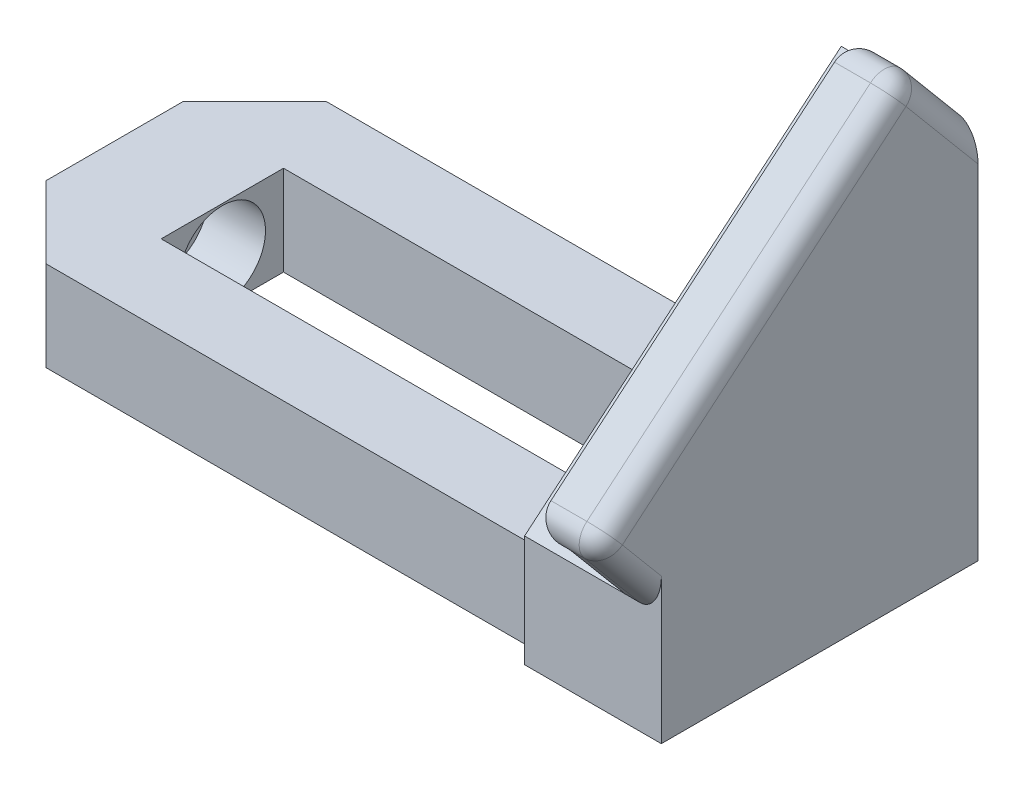
ISO-10303-21;
HEADER;
FILE_DESCRIPTION(('STEP AP214'),'2;1');
FILE_NAME('part.step','',(''),(''),'','','');
FILE_SCHEMA(('AUTOMOTIVE_DESIGN { 1 0 10303 214 1 1 1 1 }'));
ENDSEC;
DATA;
#1=APPLICATION_CONTEXT('core data for automotive mechanical design processes');
#2=APPLICATION_PROTOCOL_DEFINITION('international standard','automotive_design',2000,#1);
#3=PRODUCT_CONTEXT('',#1,'mechanical');
#4=PRODUCT('Part','Part','',(#3));
#5=PRODUCT_RELATED_PRODUCT_CATEGORY('part','',(#4));
#6=PRODUCT_DEFINITION_FORMATION('','',#4);
#7=PRODUCT_DEFINITION_CONTEXT('part definition',#1,'design');
#8=PRODUCT_DEFINITION('design','',#6,#7);
#9=PRODUCT_DEFINITION_SHAPE('','',#8);
#10=(LENGTH_UNIT() NAMED_UNIT(*) SI_UNIT(.MILLI.,.METRE.));
#11=(NAMED_UNIT(*) PLANE_ANGLE_UNIT() SI_UNIT($,.RADIAN.));
#12=(NAMED_UNIT(*) SI_UNIT($,.STERADIAN.) SOLID_ANGLE_UNIT());
#13=UNCERTAINTY_MEASURE_WITH_UNIT(LENGTH_MEASURE(1.E-05),#10,'distance_accuracy_value','');
#14=(GEOMETRIC_REPRESENTATION_CONTEXT(3) GLOBAL_UNCERTAINTY_ASSIGNED_CONTEXT((#13)) GLOBAL_UNIT_ASSIGNED_CONTEXT((#10,
#11,#12)) REPRESENTATION_CONTEXT('',''));
#15=CARTESIAN_POINT('',(0.,0.,0.));
#16=DIRECTION('',(0.,0.,1.));
#17=DIRECTION('',(1.,0.,0.));
#18=AXIS2_PLACEMENT_3D('',#15,#16,#17);
#19=CARTESIAN_POINT('',(-19.,52.4203837717999,-41.5));
#20=DIRECTION('',(0.,0.766044443118982,0.642787609686535));
#21=DIRECTION('',(0.,-0.642787609686535,0.766044443118982));
#22=AXIS2_PLACEMENT_3D('',#19,#20,#21);
#23=PLANE('',#22);
#24=DIRECTION('',(1.,0.,0.));
#25=VECTOR('',#24,1.);
#26=CARTESIAN_POINT('',(0.,15.5,2.50000000000001));
#27=LINE('',#26,#25);
#28=CARTESIAN_POINT('',(-19.,15.5,2.50000000000001));
#29=VERTEX_POINT('',#28);
#30=CARTESIAN_POINT('',(-5.5,15.5,2.50000000000001));
#31=VERTEX_POINT('',#30);
#32=EDGE_CURVE('E281',#29,#31,#27,.T.);
#33=ORIENTED_EDGE('',*,*,#32,.T.);
#34=DIRECTION('',(0.,0.642787609686535,-0.766044443118982));
#35=VECTOR('',#34,1.);
#36=CARTESIAN_POINT('',(-5.5,52.4203837717999,-41.5));
#37=LINE('',#36,#35);
#38=CARTESIAN_POINT('',(-5.5,52.4203837717999,-41.5));
#39=VERTEX_POINT('',#38);
#40=EDGE_CURVE('E390',#31,#39,#37,.T.);
#41=ORIENTED_EDGE('',*,*,#40,.T.);
#42=DIRECTION('',(1.,0.,0.));
#43=VECTOR('',#42,1.);
#44=CARTESIAN_POINT('',(-19.,52.4203837717999,-41.5));
#45=LINE('',#44,#43);
#46=CARTESIAN_POINT('',(-19.,52.4203837717999,-41.5));
#47=VERTEX_POINT('',#46);
#48=EDGE_CURVE('E279',#47,#39,#45,.T.);
#49=ORIENTED_EDGE('',*,*,#48,.F.);
#50=DIRECTION('',(0.,-0.642787609686535,0.766044443118982));
#51=VECTOR('',#50,1.);
#52=CARTESIAN_POINT('',(-19.,52.4203837717999,-41.5));
#53=LINE('',#52,#51);
#54=EDGE_CURVE('E276',#47,#29,#53,.T.);
#55=ORIENTED_EDGE('',*,*,#54,.T.);
#56=EDGE_LOOP('',(#33,#41,#49,#55));
#57=FACE_BOUND('',#56,.T.);
#58=ADVANCED_FACE('F34',(#57),#23,.T.);
#59=CARTESIAN_POINT('',(-98.,12.5,0.));
#60=DIRECTION('',(-1.,0.,0.));
#61=DIRECTION('',(0.,0.,1.));
#62=AXIS2_PLACEMENT_3D('',#59,#60,#61);
#63=PLANE('',#62);
#64=DIRECTION('',(0.,0.,-1.));
#65=VECTOR('',#64,1.);
#66=CARTESIAN_POINT('',(-98.,0.,0.));
#67=LINE('',#66,#65);
#68=CARTESIAN_POINT('',(-98.,0.,-9.99999999999998));
#69=VERTEX_POINT('',#68);
#70=CARTESIAN_POINT('',(-98.,0.,-29.));
#71=VERTEX_POINT('',#70);
#72=EDGE_CURVE('E352',#69,#71,#67,.T.);
#73=ORIENTED_EDGE('',*,*,#72,.F.);
#74=DIRECTION('',(0.,-1.,0.));
#75=VECTOR('',#74,1.);
#76=CARTESIAN_POINT('',(-98.,12.5,-9.99999999999998));
#77=LINE('',#76,#75);
#78=CARTESIAN_POINT('',(-98.,12.5,-9.99999999999998));
#79=VERTEX_POINT('',#78);
#80=EDGE_CURVE('E375',#79,#69,#77,.T.);
#81=ORIENTED_EDGE('',*,*,#80,.F.);
#82=DIRECTION('',(0.,0.,-1.));
#83=VECTOR('',#82,1.);
#84=CARTESIAN_POINT('',(-98.,12.5,0.));
#85=LINE('',#84,#83);
#86=CARTESIAN_POINT('',(-98.,12.5,-29.));
#87=VERTEX_POINT('',#86);
#88=EDGE_CURVE('E328',#79,#87,#85,.T.);
#89=ORIENTED_EDGE('',*,*,#88,.T.);
#90=DIRECTION('',(0.,-1.,0.));
#91=VECTOR('',#90,1.);
#92=CARTESIAN_POINT('',(-98.,12.5,-29.));
#93=LINE('',#92,#91);
#94=EDGE_CURVE('E366',#87,#71,#93,.T.);
#95=ORIENTED_EDGE('',*,*,#94,.T.);
#96=EDGE_LOOP('',(#73,#81,#89,#95));
#97=FACE_BOUND('',#96,.T.);
#98=ADVANCED_FACE('F456',(#97),#63,.T.);
#99=CARTESIAN_POINT('',(-44.,12.5,44.));
#100=DIRECTION('',(0.707106781186548,0.,-0.707106781186547));
#101=DIRECTION('',(-0.707106781186547,0.,-0.707106781186548));
#102=AXIS2_PLACEMENT_3D('',#99,#100,#101);
#103=PLANE('',#102);
#104=DIRECTION('',(0.707106781186547,0.,0.707106781186548));
#105=VECTOR('',#104,1.);
#106=CARTESIAN_POINT('',(-44.,0.,44.));
#107=LINE('',#106,#105);
#108=CARTESIAN_POINT('',(-88.,0.,0.));
#109=VERTEX_POINT('',#108);
#110=EDGE_CURVE('E355',#69,#109,#107,.T.);
#111=ORIENTED_EDGE('',*,*,#110,.T.);
#112=DIRECTION('',(0.,-1.,0.));
#113=VECTOR('',#112,1.);
#114=CARTESIAN_POINT('',(-88.,12.5,0.));
#115=LINE('',#114,#113);
#116=CARTESIAN_POINT('',(-88.,12.5,0.));
#117=VERTEX_POINT('',#116);
#118=EDGE_CURVE('E372',#117,#109,#115,.T.);
#119=ORIENTED_EDGE('',*,*,#118,.F.);
#120=DIRECTION('',(0.707106781186547,0.,0.707106781186548));
#121=VECTOR('',#120,1.);
#122=CARTESIAN_POINT('',(-44.,12.5,44.));
#123=LINE('',#122,#121);
#124=EDGE_CURVE('E331',#79,#117,#123,.T.);
#125=ORIENTED_EDGE('',*,*,#124,.F.);
#126=ORIENTED_EDGE('',*,*,#80,.T.);
#127=EDGE_LOOP('',(#111,#119,#125,#126));
#128=FACE_BOUND('',#127,.T.);
#129=ADVANCED_FACE('F462',(#128),#103,.F.);
#130=CARTESIAN_POINT('',(0.,12.5,0.));
#131=DIRECTION('',(0.,0.,1.));
#132=DIRECTION('',(1.,0.,0.));
#133=AXIS2_PLACEMENT_3D('',#130,#131,#132);
#134=PLANE('',#133);
#135=DIRECTION('',(0.,-1.,0.));
#136=VECTOR('',#135,1.);
#137=CARTESIAN_POINT('',(-19.,12.5,0.));
#138=LINE('',#137,#136);
#139=CARTESIAN_POINT('',(-19.,12.5,0.));
#140=VERTEX_POINT('',#139);
#141=CARTESIAN_POINT('',(-19.,0.,0.));
#142=VERTEX_POINT('',#141);
#143=EDGE_CURVE('E309',#140,#142,#138,.T.);
#144=ORIENTED_EDGE('',*,*,#143,.F.);
#145=DIRECTION('',(-1.,0.,0.));
#146=VECTOR('',#145,1.);
#147=CARTESIAN_POINT('',(0.,12.5,0.));
#148=LINE('',#147,#146);
#149=EDGE_CURVE('E334',#140,#117,#148,.T.);
#150=ORIENTED_EDGE('',*,*,#149,.T.);
#151=ORIENTED_EDGE('',*,*,#118,.T.);
#152=DIRECTION('',(-1.,0.,0.));
#153=VECTOR('',#152,1.);
#154=CARTESIAN_POINT('',(0.,0.,0.));
#155=LINE('',#154,#153);
#156=EDGE_CURVE('E358',#142,#109,#155,.T.);
#157=ORIENTED_EDGE('',*,*,#156,.F.);
#158=EDGE_LOOP('',(#144,#150,#151,#157));
#159=FACE_BOUND('',#158,.T.);
#160=ADVANCED_FACE('F502',(#159),#134,.T.);
#161=CARTESIAN_POINT('',(0.,12.5,0.));
#162=DIRECTION('',(-1.,0.,0.));
#163=DIRECTION('',(0.,0.,1.));
#164=AXIS2_PLACEMENT_3D('',#161,#162,#163);
#165=PLANE('',#164);
#166=DIRECTION('',(0.,0.766044443118981,0.642787609686535));
#167=VECTOR('',#166,1.);
#168=CARTESIAN_POINT('',(0.,17.4283628290596,0.201866670643088));
#169=LINE('',#168,#167);
#170=CARTESIAN_POINT('',(0.,26.6208961464874,7.91531798688151));
#171=VERTEX_POINT('',#170);
#172=CARTESIAN_POINT('',(0.,20.1671714805812,2.50000000000001));
#173=VERTEX_POINT('',#172);
#174=EDGE_CURVE('E238',#171,#173,#169,.F.);
#175=ORIENTED_EDGE('',*,*,#174,.T.);
#176=DIRECTION('',(0.,1.,0.));
#177=VECTOR('',#176,1.);
#178=CARTESIAN_POINT('',(0.,0.,2.50000000000001));
#179=LINE('',#178,#177);
#180=CARTESIAN_POINT('',(0.,0.,2.50000000000001));
#181=VERTEX_POINT('',#180);
#182=EDGE_CURVE('E295',#181,#173,#179,.T.);
#183=ORIENTED_EDGE('',*,*,#182,.F.);
#184=DIRECTION('',(0.,0.,-1.));
#185=VECTOR('',#184,1.);
#186=CARTESIAN_POINT('',(0.,0.,0.));
#187=LINE('',#186,#185);
#188=CARTESIAN_POINT('',(0.,0.,-41.5));
#189=VERTEX_POINT('',#188);
#190=EDGE_CURVE('E360',#181,#189,#187,.T.);
#191=ORIENTED_EDGE('',*,*,#190,.T.);
#192=DIRECTION('',(0.,1.,0.));
#193=VECTOR('',#192,1.);
#194=CARTESIAN_POINT('',(0.,0.,-41.5));
#195=LINE('',#194,#193);
#196=CARTESIAN_POINT('',(0.,47.7532122912187,-41.5));
#197=VERTEX_POINT('',#196);
#198=EDGE_CURVE('E294',#189,#197,#195,.T.);
#199=ORIENTED_EDGE('',*,*,#198,.T.);
#200=DIRECTION('',(0.,0.766044443118981,0.642787609686535));
#201=VECTOR('',#200,1.);
#202=CARTESIAN_POINT('',(0.,47.5005389849747,-41.7120180780777));
#203=LINE('',#202,#201);
#204=CARTESIAN_POINT('',(0.,59.6845542601681,-31.4884153544046));
#205=VERTEX_POINT('',#204);
#206=EDGE_CURVE('E234',#197,#205,#203,.T.);
#207=ORIENTED_EDGE('',*,*,#206,.T.);
#208=DIRECTION('',(0.,0.642787609686535,-0.766044443118982));
#209=VECTOR('',#208,1.);
#210=CARTESIAN_POINT('',(0.,24.6840152751935,10.2236027236731));
#211=LINE('',#210,#209);
#212=EDGE_CURVE('E236',#205,#171,#211,.F.);
#213=ORIENTED_EDGE('',*,*,#212,.T.);
#214=EDGE_LOOP('',(#175,#183,#191,#199,#207,#213));
#215=FACE_BOUND('',#214,.T.);
#216=ADVANCED_FACE('F438',(#215),#165,.F.);
#217=CARTESIAN_POINT('',(0.,12.5,-39.));
#218=DIRECTION('',(0.,0.,1.));
#219=DIRECTION('',(1.,0.,0.));
#220=AXIS2_PLACEMENT_3D('',#217,#218,#219);
#221=PLANE('',#220);
#222=DIRECTION('',(-1.,0.,0.));
#223=VECTOR('',#222,1.);
#224=CARTESIAN_POINT('',(0.,12.5,-39.));
#225=LINE('',#224,#223);
#226=CARTESIAN_POINT('',(-19.,12.5,-39.));
#227=VERTEX_POINT('',#226);
#228=CARTESIAN_POINT('',(-88.,12.5,-39.));
#229=VERTEX_POINT('',#228);
#230=EDGE_CURVE('E336',#227,#229,#225,.T.);
#231=ORIENTED_EDGE('',*,*,#230,.F.);
#232=DIRECTION('',(0.,-1.,0.));
#233=VECTOR('',#232,1.);
#234=CARTESIAN_POINT('',(-19.,12.5,-39.));
#235=LINE('',#234,#233);
#236=CARTESIAN_POINT('',(-19.,0.,-39.));
#237=VERTEX_POINT('',#236);
#238=EDGE_CURVE('E307',#227,#237,#235,.T.);
#239=ORIENTED_EDGE('',*,*,#238,.T.);
#240=DIRECTION('',(-1.,0.,0.));
#241=VECTOR('',#240,1.);
#242=CARTESIAN_POINT('',(0.,0.,-39.));
#243=LINE('',#242,#241);
#244=CARTESIAN_POINT('',(-88.,0.,-39.));
#245=VERTEX_POINT('',#244);
#246=EDGE_CURVE('E362',#237,#245,#243,.T.);
#247=ORIENTED_EDGE('',*,*,#246,.T.);
#248=DIRECTION('',(0.,-1.,0.));
#249=VECTOR('',#248,1.);
#250=CARTESIAN_POINT('',(-88.,12.5,-39.));
#251=LINE('',#250,#249);
#252=EDGE_CURVE('E368',#229,#245,#251,.T.);
#253=ORIENTED_EDGE('',*,*,#252,.F.);
#254=EDGE_LOOP('',(#231,#239,#247,#253));
#255=FACE_BOUND('',#254,.T.);
#256=ADVANCED_FACE('F495',(#255),#221,.F.);
#257=CARTESIAN_POINT('',(0.,12.5,-11.));
#258=DIRECTION('',(0.,0.,1.));
#259=DIRECTION('',(1.,0.,0.));
#260=AXIS2_PLACEMENT_3D('',#257,#258,#259);
#261=PLANE('',#260);
#262=DIRECTION('',(-1.,0.,0.));
#263=VECTOR('',#262,1.);
#264=CARTESIAN_POINT('',(0.,0.,-11.));
#265=LINE('',#264,#263);
#266=CARTESIAN_POINT('',(-19.,0.,-11.));
#267=VERTEX_POINT('',#266);
#268=CARTESIAN_POINT('',(-83.,0.,-11.));
#269=VERTEX_POINT('',#268);
#270=EDGE_CURVE('E316',#267,#269,#265,.T.);
#271=ORIENTED_EDGE('',*,*,#270,.T.);
#272=DIRECTION('',(0.,-1.,0.));
#273=VECTOR('',#272,1.);
#274=CARTESIAN_POINT('',(-83.,12.5,-11.));
#275=LINE('',#274,#273);
#276=CARTESIAN_POINT('',(-83.,12.5,-11.));
#277=VERTEX_POINT('',#276);
#278=EDGE_CURVE('E369',#277,#269,#275,.T.);
#279=ORIENTED_EDGE('',*,*,#278,.F.);
#280=DIRECTION('',(-1.,0.,0.));
#281=VECTOR('',#280,1.);
#282=CARTESIAN_POINT('',(0.,12.5,-11.));
#283=LINE('',#282,#281);
#284=CARTESIAN_POINT('',(-19.,12.5,-11.));
#285=VERTEX_POINT('',#284);
#286=EDGE_CURVE('E319',#285,#277,#283,.T.);
#287=ORIENTED_EDGE('',*,*,#286,.F.);
#288=DIRECTION('',(0.,-1.,0.));
#289=VECTOR('',#288,1.);
#290=CARTESIAN_POINT('',(-19.,12.5,-11.));
#291=LINE('',#290,#289);
#292=EDGE_CURVE('E340',#285,#267,#291,.T.);
#293=ORIENTED_EDGE('',*,*,#292,.T.);
#294=EDGE_LOOP('',(#271,#279,#287,#293));
#295=FACE_BOUND('',#294,.T.);
#296=ADVANCED_FACE('F498',(#295),#261,.F.);
#297=CARTESIAN_POINT('',(-83.,12.5,0.));
#298=DIRECTION('',(-1.,0.,0.));
#299=DIRECTION('',(0.,0.,1.));
#300=AXIS2_PLACEMENT_3D('',#297,#298,#299);
#301=PLANE('',#300);
#302=CARTESIAN_POINT('',(-83.,6.25,-19.5000000000001));
#303=DIRECTION('',(1.,0.,0.));
#304=DIRECTION('',(0.,0.,-1.));
#305=AXIS2_PLACEMENT_3D('',#302,#303,#304);
#306=CIRCLE('',#305,6.);
#307=CARTESIAN_POINT('',(-83.,6.25,-25.5000000000001));
#308=VERTEX_POINT('',#307);
#309=EDGE_CURVE('E312',#308,#308,#306,.T.);
#310=ORIENTED_EDGE('',*,*,#309,.F.);
#311=EDGE_LOOP('',(#310));
#312=FACE_BOUND('',#311,.T.);
#313=DIRECTION('',(0.,0.,-1.));
#314=VECTOR('',#313,1.);
#315=CARTESIAN_POINT('',(-83.,0.,0.));
#316=LINE('',#315,#314);
#317=CARTESIAN_POINT('',(-83.,0.,-28.));
#318=VERTEX_POINT('',#317);
#319=EDGE_CURVE('E343',#269,#318,#316,.T.);
#320=ORIENTED_EDGE('',*,*,#319,.T.);
#321=DIRECTION('',(0.,-1.,0.));
#322=VECTOR('',#321,1.);
#323=CARTESIAN_POINT('',(-83.,12.5,-28.));
#324=LINE('',#323,#322);
#325=CARTESIAN_POINT('',(-83.,12.5,-28.));
#326=VERTEX_POINT('',#325);
#327=EDGE_CURVE('E381',#326,#318,#324,.T.);
#328=ORIENTED_EDGE('',*,*,#327,.F.);
#329=DIRECTION('',(0.,0.,-1.));
#330=VECTOR('',#329,1.);
#331=CARTESIAN_POINT('',(-83.,12.5,0.));
#332=LINE('',#331,#330);
#333=EDGE_CURVE('E322',#277,#326,#332,.T.);
#334=ORIENTED_EDGE('',*,*,#333,.F.);
#335=ORIENTED_EDGE('',*,*,#278,.T.);
#336=EDGE_LOOP('',(#320,#328,#334,#335));
#337=FACE_BOUND('',#336,.T.);
#338=ADVANCED_FACE('F515',(#312,#337),#301,.F.);
#339=CARTESIAN_POINT('',(0.,12.5,-28.));
#340=DIRECTION('',(0.,0.,1.));
#341=DIRECTION('',(1.,0.,0.));
#342=AXIS2_PLACEMENT_3D('',#339,#340,#341);
#343=PLANE('',#342);
#344=DIRECTION('',(-1.,0.,0.));
#345=VECTOR('',#344,1.);
#346=CARTESIAN_POINT('',(0.,0.,-28.));
#347=LINE('',#346,#345);
#348=CARTESIAN_POINT('',(-19.,0.,-28.));
#349=VERTEX_POINT('',#348);
#350=EDGE_CURVE('E346',#349,#318,#347,.T.);
#351=ORIENTED_EDGE('',*,*,#350,.F.);
#352=DIRECTION('',(0.,-1.,0.));
#353=VECTOR('',#352,1.);
#354=CARTESIAN_POINT('',(-19.,12.5,-28.));
#355=LINE('',#354,#353);
#356=CARTESIAN_POINT('',(-19.,12.5,-28.));
#357=VERTEX_POINT('',#356);
#358=EDGE_CURVE('E379',#357,#349,#355,.T.);
#359=ORIENTED_EDGE('',*,*,#358,.F.);
#360=DIRECTION('',(-1.,0.,0.));
#361=VECTOR('',#360,1.);
#362=CARTESIAN_POINT('',(0.,12.5,-28.));
#363=LINE('',#362,#361);
#364=EDGE_CURVE('E325',#357,#326,#363,.T.);
#365=ORIENTED_EDGE('',*,*,#364,.T.);
#366=ORIENTED_EDGE('',*,*,#327,.T.);
#367=EDGE_LOOP('',(#351,#359,#365,#366));
#368=FACE_BOUND('',#367,.T.);
#369=ADVANCED_FACE('F511',(#368),#343,.T.);
#370=CARTESIAN_POINT('',(-19.,12.5,0.));
#371=DIRECTION('',(-1.,0.,0.));
#372=DIRECTION('',(0.,0.,1.));
#373=AXIS2_PLACEMENT_3D('',#370,#371,#372);
#374=PLANE('',#373);
#375=DIRECTION('',(0.,0.,-1.));
#376=VECTOR('',#375,1.);
#377=CARTESIAN_POINT('',(-19.,0.,0.));
#378=LINE('',#377,#376);
#379=EDGE_CURVE('E349',#267,#349,#378,.T.);
#380=ORIENTED_EDGE('',*,*,#379,.F.);
#381=ORIENTED_EDGE('',*,*,#292,.F.);
#382=DIRECTION('',(0.,0.,1.));
#383=VECTOR('',#382,1.);
#384=CARTESIAN_POINT('',(-19.,12.5,0.));
#385=LINE('',#384,#383);
#386=EDGE_CURVE('E297',#285,#140,#385,.T.);
#387=ORIENTED_EDGE('',*,*,#386,.T.);
#388=ORIENTED_EDGE('',*,*,#143,.T.);
#389=DIRECTION('',(0.,0.,1.));
#390=VECTOR('',#389,1.);
#391=CARTESIAN_POINT('',(-19.,0.,-41.5));
#392=LINE('',#391,#390);
#393=CARTESIAN_POINT('',(-19.,0.,2.50000000000001));
#394=VERTEX_POINT('',#393);
#395=EDGE_CURVE('E287',#142,#394,#392,.T.);
#396=ORIENTED_EDGE('',*,*,#395,.T.);
#397=DIRECTION('',(0.,1.,0.));
#398=VECTOR('',#397,1.);
#399=CARTESIAN_POINT('',(-19.,0.,2.50000000000001));
#400=LINE('',#399,#398);
#401=EDGE_CURVE('E298',#394,#29,#400,.T.);
#402=ORIENTED_EDGE('',*,*,#401,.T.);
#403=ORIENTED_EDGE('',*,*,#54,.F.);
#404=DIRECTION('',(0.,1.,0.));
#405=VECTOR('',#404,1.);
#406=CARTESIAN_POINT('',(-19.,0.,-41.5));
#407=LINE('',#406,#405);
#408=CARTESIAN_POINT('',(-19.,0.,-41.5));
#409=VERTEX_POINT('',#408);
#410=EDGE_CURVE('E300',#409,#47,#407,.T.);
#411=ORIENTED_EDGE('',*,*,#410,.F.);
#412=EDGE_CURVE('E288',#409,#237,#392,.T.);
#413=ORIENTED_EDGE('',*,*,#412,.T.);
#414=ORIENTED_EDGE('',*,*,#238,.F.);
#415=EDGE_CURVE('E306',#227,#357,#385,.T.);
#416=ORIENTED_EDGE('',*,*,#415,.T.);
#417=ORIENTED_EDGE('',*,*,#358,.T.);
#418=EDGE_LOOP('',(#380,#381,#387,#388,#396,#402,#403,#411,#413,#414,#416,#417));
#419=FACE_BOUND('',#418,.T.);
#420=ADVANCED_FACE('F493',(#419),#374,.T.);
#421=CARTESIAN_POINT('',(-63.5,12.5,-63.5));
#422=DIRECTION('',(0.707106781186548,0.,0.707106781186548));
#423=DIRECTION('',(0.707106781186548,0.,-0.707106781186548));
#424=AXIS2_PLACEMENT_3D('',#421,#422,#423);
#425=PLANE('',#424);
#426=DIRECTION('',(-0.707106781186548,0.,0.707106781186548));
#427=VECTOR('',#426,1.);
#428=CARTESIAN_POINT('',(-63.5,0.,-63.5));
#429=LINE('',#428,#427);
#430=EDGE_CURVE('E323',#245,#71,#429,.T.);
#431=ORIENTED_EDGE('',*,*,#430,.T.);
#432=ORIENTED_EDGE('',*,*,#94,.F.);
#433=DIRECTION('',(-0.707106781186548,0.,0.707106781186548));
#434=VECTOR('',#433,1.);
#435=CARTESIAN_POINT('',(-63.5,12.5,-63.5));
#436=LINE('',#435,#434);
#437=EDGE_CURVE('E338',#229,#87,#436,.T.);
#438=ORIENTED_EDGE('',*,*,#437,.F.);
#439=ORIENTED_EDGE('',*,*,#252,.T.);
#440=EDGE_LOOP('',(#431,#432,#438,#439));
#441=FACE_BOUND('',#440,.T.);
#442=ADVANCED_FACE('F486',(#441),#425,.F.);
#443=CARTESIAN_POINT('',(0.,12.5,0.));
#444=DIRECTION('',(0.,1.,0.));
#445=DIRECTION('',(0.,0.,1.));
#446=AXIS2_PLACEMENT_3D('',#443,#444,#445);
#447=PLANE('',#446);
#448=ORIENTED_EDGE('',*,*,#415,.F.);
#449=ORIENTED_EDGE('',*,*,#230,.T.);
#450=ORIENTED_EDGE('',*,*,#437,.T.);
#451=ORIENTED_EDGE('',*,*,#88,.F.);
#452=ORIENTED_EDGE('',*,*,#124,.T.);
#453=ORIENTED_EDGE('',*,*,#149,.F.);
#454=ORIENTED_EDGE('',*,*,#386,.F.);
#455=ORIENTED_EDGE('',*,*,#286,.T.);
#456=ORIENTED_EDGE('',*,*,#333,.T.);
#457=ORIENTED_EDGE('',*,*,#364,.F.);
#458=EDGE_LOOP('',(#448,#449,#450,#451,#452,#453,#454,#455,#456,#457));
#459=FACE_BOUND('',#458,.T.);
#460=ADVANCED_FACE('F483',(#459),#447,.T.);
#461=CARTESIAN_POINT('',(0.,0.,0.));
#462=DIRECTION('',(0.,1.,0.));
#463=DIRECTION('',(0.,0.,1.));
#464=AXIS2_PLACEMENT_3D('',#461,#462,#463);
#465=PLANE('',#464);
#466=ORIENTED_EDGE('',*,*,#379,.T.);
#467=ORIENTED_EDGE('',*,*,#350,.T.);
#468=ORIENTED_EDGE('',*,*,#319,.F.);
#469=ORIENTED_EDGE('',*,*,#270,.F.);
#470=EDGE_LOOP('',(#466,#467,#468,#469));
#471=FACE_BOUND('',#470,.T.);
#472=ORIENTED_EDGE('',*,*,#246,.F.);
#473=ORIENTED_EDGE('',*,*,#412,.F.);
#474=DIRECTION('',(-1.,0.,0.));
#475=VECTOR('',#474,1.);
#476=CARTESIAN_POINT('',(0.,0.,-41.5));
#477=LINE('',#476,#475);
#478=EDGE_CURVE('E284',#189,#409,#477,.T.);
#479=ORIENTED_EDGE('',*,*,#478,.F.);
#480=ORIENTED_EDGE('',*,*,#190,.F.);
#481=DIRECTION('',(1.,0.,0.));
#482=VECTOR('',#481,1.);
#483=CARTESIAN_POINT('',(0.,0.,2.50000000000001));
#484=LINE('',#483,#482);
#485=EDGE_CURVE('E291',#394,#181,#484,.T.);
#486=ORIENTED_EDGE('',*,*,#485,.F.);
#487=ORIENTED_EDGE('',*,*,#395,.F.);
#488=ORIENTED_EDGE('',*,*,#156,.T.);
#489=ORIENTED_EDGE('',*,*,#110,.F.);
#490=ORIENTED_EDGE('',*,*,#72,.T.);
#491=ORIENTED_EDGE('',*,*,#430,.F.);
#492=EDGE_LOOP('',(#472,#473,#479,#480,#486,#487,#488,#489,#490,#491));
#493=FACE_BOUND('',#492,.T.);
#494=ADVANCED_FACE('F481',(#471,#493),#465,.F.);
#495=CARTESIAN_POINT('',(-91.,6.25,-19.5000000000001));
#496=DIRECTION('',(1.,0.,0.));
#497=DIRECTION('',(0.,0.,-1.));
#498=AXIS2_PLACEMENT_3D('',#495,#496,#497);
#499=CYLINDRICAL_SURFACE('',#498,6.);
#500=CARTESIAN_POINT('',(-91.,6.25,-19.5000000000001));
#501=DIRECTION('',(1.,0.,0.));
#502=DIRECTION('',(0.,0.,-1.));
#503=AXIS2_PLACEMENT_3D('',#500,#501,#502);
#504=CIRCLE('',#503,6.);
#505=CARTESIAN_POINT('',(-91.,6.25,-25.5000000000001));
#506=VERTEX_POINT('',#505);
#507=EDGE_CURVE('E313',#506,#506,#504,.T.);
#508=ORIENTED_EDGE('',*,*,#507,.F.);
#509=EDGE_LOOP('',(#508));
#510=FACE_BOUND('',#509,.T.);
#511=ORIENTED_EDGE('',*,*,#309,.T.);
#512=EDGE_LOOP('',(#511));
#513=FACE_BOUND('',#512,.T.);
#514=ADVANCED_FACE('F477',(#510,#513),#499,.F.);
#515=CARTESIAN_POINT('',(-91.,6.25,-19.5000000000001));
#516=DIRECTION('',(1.,0.,0.));
#517=DIRECTION('',(0.,0.,-1.));
#518=AXIS2_PLACEMENT_3D('',#515,#516,#517);
#519=PLANE('',#518);
#520=ORIENTED_EDGE('',*,*,#507,.T.);
#521=EDGE_LOOP('',(#520));
#522=FACE_BOUND('',#521,.T.);
#523=ADVANCED_FACE('F472',(#522),#519,.T.);
#524=CARTESIAN_POINT('',(0.,0.,2.50000000000001));
#525=DIRECTION('',(0.,0.,1.));
#526=DIRECTION('',(1.,0.,0.));
#527=AXIS2_PLACEMENT_3D('',#524,#525,#526);
#528=PLANE('',#527);
#529=ORIENTED_EDGE('',*,*,#182,.T.);
#530=CARTESIAN_POINT('',(-3.,20.1671714805812,2.50000000000001));
#531=DIRECTION('',(0.,0.,1.));
#532=DIRECTION('',(0.,-1.,0.));
#533=AXIS2_PLACEMENT_3D('',#530,#531,#532);
#534=ELLIPSE('',#533,4.66717148058127,3.);
#535=CARTESIAN_POINT('',(-3.,15.5,2.50000000000003));
#536=VERTEX_POINT('',#535);
#537=EDGE_CURVE('E11',#173,#536,#534,.F.);
#538=ORIENTED_EDGE('',*,*,#537,.T.);
#539=DIRECTION('',(1.,0.,0.));
#540=VECTOR('',#539,1.);
#541=CARTESIAN_POINT('',(-5.,15.5,2.50000000000003));
#542=LINE('',#541,#540);
#543=EDGE_CURVE('E216',#31,#536,#542,.T.);
#544=ORIENTED_EDGE('',*,*,#543,.F.);
#545=ORIENTED_EDGE('',*,*,#32,.F.);
#546=ORIENTED_EDGE('',*,*,#401,.F.);
#547=ORIENTED_EDGE('',*,*,#485,.T.);
#548=EDGE_LOOP('',(#529,#538,#544,#545,#546,#547));
#549=FACE_BOUND('',#548,.T.);
#550=ADVANCED_FACE('F468',(#549),#528,.T.);
#551=CARTESIAN_POINT('',(0.,0.,-41.5));
#552=DIRECTION('',(0.,0.,-1.));
#553=DIRECTION('',(-1.,0.,0.));
#554=AXIS2_PLACEMENT_3D('',#551,#552,#553);
#555=PLANE('',#554);
#556=DIRECTION('',(1.,0.,0.));
#557=VECTOR('',#556,1.);
#558=CARTESIAN_POINT('',(-5.,52.4203837717999,-41.5));
#559=LINE('',#558,#557);
#560=CARTESIAN_POINT('',(-3.,52.4203837717999,-41.5));
#561=VERTEX_POINT('',#560);
#562=EDGE_CURVE('E261',#39,#561,#559,.T.);
#563=ORIENTED_EDGE('',*,*,#562,.T.);
#564=CARTESIAN_POINT('',(-3.,47.7532122912187,-41.5));
#565=DIRECTION('',(0.,0.,-1.));
#566=DIRECTION('',(0.,1.,0.));
#567=AXIS2_PLACEMENT_3D('',#564,#565,#566);
#568=ELLIPSE('',#567,4.66717148058127,3.);
#569=EDGE_CURVE('E43',#561,#197,#568,.T.);
#570=ORIENTED_EDGE('',*,*,#569,.T.);
#571=ORIENTED_EDGE('',*,*,#198,.F.);
#572=ORIENTED_EDGE('',*,*,#478,.T.);
#573=ORIENTED_EDGE('',*,*,#410,.T.);
#574=ORIENTED_EDGE('',*,*,#48,.T.);
#575=EDGE_LOOP('',(#563,#570,#571,#572,#573,#574));
#576=FACE_BOUND('',#575,.T.);
#577=ADVANCED_FACE('F471',(#576),#555,.T.);
#578=CARTESIAN_POINT('',(0.,26.9906666467847,12.1418141452981));
#579=DIRECTION('',(0.,-0.766044443118982,-0.642787609686535));
#580=DIRECTION('',(0.,0.642787609686535,-0.766044443118982));
#581=AXIS2_PLACEMENT_3D('',#578,#579,#580);
#582=PLANE('',#581);
#583=DIRECTION('',(0.,0.642787609686535,-0.766044443118982));
#584=VECTOR('',#583,1.);
#585=CARTESIAN_POINT('',(-3.,26.9906666467847,12.1418141452981));
#586=LINE('',#585,#584);
#587=CARTESIAN_POINT('',(-3.,28.9190294758443,9.84368081594112));
#588=VERTEX_POINT('',#587);
#589=CARTESIAN_POINT('',(-3.,61.982687589525,-29.560052525345));
#590=VERTEX_POINT('',#589);
#591=EDGE_CURVE('E227',#588,#590,#586,.T.);
#592=ORIENTED_EDGE('',*,*,#591,.T.);
#593=DIRECTION('',(-1.,0.,0.));
#594=VECTOR('',#593,1.);
#595=CARTESIAN_POINT('',(0.,61.982687589525,-29.560052525345));
#596=LINE('',#595,#594);
#597=CARTESIAN_POINT('',(-8.,61.982687589525,-29.560052525345));
#598=VERTEX_POINT('',#597);
#599=EDGE_CURVE('E222',#590,#598,#596,.T.);
#600=ORIENTED_EDGE('',*,*,#599,.T.);
#601=DIRECTION('',(0.,0.642787609686535,-0.766044443118982));
#602=VECTOR('',#601,1.);
#603=CARTESIAN_POINT('',(-8.,26.9906666467847,12.1418141452981));
#604=LINE('',#603,#602);
#605=CARTESIAN_POINT('',(-8.,28.9190294758443,9.84368081594112));
#606=VERTEX_POINT('',#605);
#607=EDGE_CURVE('E205',#606,#598,#604,.T.);
#608=ORIENTED_EDGE('',*,*,#607,.F.);
#609=DIRECTION('',(-1.,0.,0.));
#610=VECTOR('',#609,1.);
#611=CARTESIAN_POINT('',(0.,28.9190294758443,9.84368081594112));
#612=LINE('',#611,#610);
#613=EDGE_CURVE('E221',#606,#588,#612,.F.);
#614=ORIENTED_EDGE('',*,*,#613,.T.);
#615=EDGE_LOOP('',(#592,#600,#608,#614));
#616=FACE_BOUND('',#615,.T.);
#617=ADVANCED_FACE('F405',(#616),#582,.F.);
#618=CARTESIAN_POINT('',(-8.,26.9906666467847,12.1418141452981));
#619=DIRECTION('',(0.894427190999916,0.342585489720003,0.287463358070739));
#620=DIRECTION('',(-0.357682690979345,0.93384318414484,0.));
#621=AXIS2_PLACEMENT_3D('',#618,#619,#620);
#622=PLANE('',#621);
#623=ORIENTED_EDGE('',*,*,#607,.T.);
#624=CARTESIAN_POINT('',(-6.5,59.6845542601681,-31.4884153544047));
#625=DIRECTION('',(0.894427190999916,0.342585489720003,0.287463358070739));
#626=DIRECTION('',(-0.447213595499958,0.685170979440005,0.574926716141478));
#627=AXIS2_PLACEMENT_3D('',#624,#625,#626);
#628=ELLIPSE('',#627,3.35410196624969,3.);
#629=CARTESIAN_POINT('',(-6.5,61.6129170892277,-33.7865486837616));
#630=VERTEX_POINT('',#629);
#631=EDGE_CURVE('E201',#598,#630,#628,.F.);
#632=ORIENTED_EDGE('',*,*,#631,.T.);
#633=DIRECTION('',(0.,0.642787609686535,-0.766044443118982));
#634=VECTOR('',#633,1.);
#635=CARTESIAN_POINT('',(-6.5,24.6925333174278,10.2134513162384));
#636=LINE('',#635,#634);
#637=CARTESIAN_POINT('',(-6.5,24.6925333174278,10.2134513162384));
#638=VERTEX_POINT('',#637);
#639=EDGE_CURVE('E194',#638,#630,#636,.T.);
#640=ORIENTED_EDGE('',*,*,#639,.F.);
#641=CARTESIAN_POINT('',(-6.5,26.6208961464874,7.91531798688151));
#642=DIRECTION('',(0.894427190999916,0.342585489720003,0.287463358070739));
#643=DIRECTION('',(0.447213595499958,-0.685170979440005,-0.574926716141478));
#644=AXIS2_PLACEMENT_3D('',#641,#642,#643);
#645=ELLIPSE('',#644,3.35410196624969,3.);
#646=EDGE_CURVE('E199',#638,#606,#645,.F.);
#647=ORIENTED_EDGE('',*,*,#646,.T.);
#648=EDGE_LOOP('',(#623,#632,#640,#647));
#649=FACE_BOUND('',#648,.T.);
#650=ADVANCED_FACE('F197',(#649),#622,.F.);
#651=CARTESIAN_POINT('',(-6.5,24.6925333174278,10.2134513162384));
#652=DIRECTION('',(0.,0.766044443118982,0.642787609686535));
#653=DIRECTION('',(0.,-0.642787609686535,0.766044443118982));
#654=AXIS2_PLACEMENT_3D('',#651,#652,#653);
#655=PLANE('',#654);
#656=DIRECTION('',(1.,0.,0.));
#657=VECTOR('',#656,1.);
#658=CARTESIAN_POINT('',(-6.5,61.6129170892277,-33.7865486837616));
#659=LINE('',#658,#657);
#660=CARTESIAN_POINT('',(-5.5,61.6129170892277,-33.7865486837616));
#661=VERTEX_POINT('',#660);
#662=EDGE_CURVE('E264',#630,#661,#659,.T.);
#663=ORIENTED_EDGE('',*,*,#662,.T.);
#664=DIRECTION('',(0.,0.642787609686535,-0.766044443118982));
#665=VECTOR('',#664,1.);
#666=CARTESIAN_POINT('',(-5.5,24.6925333174278,10.2134513162384));
#667=LINE('',#666,#665);
#668=CARTESIAN_POINT('',(-5.5,24.6925333174278,10.2134513162384));
#669=VERTEX_POINT('',#668);
#670=EDGE_CURVE('E213',#661,#669,#667,.F.);
#671=ORIENTED_EDGE('',*,*,#670,.T.);
#672=DIRECTION('',(1.,0.,0.));
#673=VECTOR('',#672,1.);
#674=CARTESIAN_POINT('',(-6.5,24.6925333174278,10.2134513162384));
#675=LINE('',#674,#673);
#676=EDGE_CURVE('E210',#638,#669,#675,.T.);
#677=ORIENTED_EDGE('',*,*,#676,.F.);
#678=ORIENTED_EDGE('',*,*,#639,.T.);
#679=EDGE_LOOP('',(#663,#671,#677,#678));
#680=FACE_BOUND('',#679,.T.);
#681=ADVANCED_FACE('F211',(#680),#655,.F.);
#682=CARTESIAN_POINT('',(-5.,24.6925333174278,10.2134513162384));
#683=DIRECTION('',(1.,0.,0.));
#684=DIRECTION('',(0.,1.,0.));
#685=AXIS2_PLACEMENT_3D('',#682,#683,#684);
#686=PLANE('',#685);
#687=DIRECTION('',(0.,-0.766044443118982,-0.642787609686535));
#688=VECTOR('',#687,1.);
#689=CARTESIAN_POINT('',(-5.,24.6925333174278,10.2134513162384));
#690=LINE('',#689,#688);
#691=CARTESIAN_POINT('',(-5.,24.3095110958683,9.89205751139518));
#692=VERTEX_POINT('',#691);
#693=CARTESIAN_POINT('',(-5.,15.8830222215595,2.8213938048433));
#694=VERTEX_POINT('',#693);
#695=EDGE_CURVE('E206',#692,#694,#690,.T.);
#696=ORIENTED_EDGE('',*,*,#695,.F.);
#697=DIRECTION('',(0.,0.642787609686535,-0.766044443118982));
#698=VECTOR('',#697,1.);
#699=CARTESIAN_POINT('',(-5.,61.2298948676682,-34.1079424886049));
#700=LINE('',#699,#698);
#701=CARTESIAN_POINT('',(-5.,61.2298948676682,-34.1079424886049));
#702=VERTEX_POINT('',#701);
#703=EDGE_CURVE('E386',#692,#702,#700,.T.);
#704=ORIENTED_EDGE('',*,*,#703,.T.);
#705=DIRECTION('',(0.,-0.766044443118982,-0.642787609686535));
#706=VECTOR('',#705,1.);
#707=CARTESIAN_POINT('',(-5.,61.6129170892277,-33.7865486837616));
#708=LINE('',#707,#706);
#709=CARTESIAN_POINT('',(-5.,52.8034059933594,-41.1786061951568));
#710=VERTEX_POINT('',#709);
#711=EDGE_CURVE('E269',#702,#710,#708,.T.);
#712=ORIENTED_EDGE('',*,*,#711,.T.);
#713=DIRECTION('',(0.,0.642787609686535,-0.766044443118982));
#714=VECTOR('',#713,1.);
#715=CARTESIAN_POINT('',(-5.,15.8830222215595,2.8213938048433));
#716=LINE('',#715,#714);
#717=EDGE_CURVE('E377',#710,#694,#716,.F.);
#718=ORIENTED_EDGE('',*,*,#717,.T.);
#719=EDGE_LOOP('',(#696,#704,#712,#718));
#720=FACE_BOUND('',#719,.T.);
#721=ADVANCED_FACE('F425',(#720),#686,.F.);
#722=CARTESIAN_POINT('',(0.,5.17321693181594,-6.16519986376089));
#723=DIRECTION('',(0.,-0.642787609686535,0.766044443118981));
#724=DIRECTION('',(0.,-0.766044443118981,-0.642787609686535));
#725=AXIS2_PLACEMENT_3D('',#722,#723,#724);
#726=PLANE('',#725);
#727=DIRECTION('',(0.,0.766044443118981,0.642787609686535));
#728=VECTOR('',#727,1.);
#729=CARTESIAN_POINT('',(-3.,26.9906666467847,12.1418141452981));
#730=LINE('',#729,#728);
#731=CARTESIAN_POINT('',(-3.,24.6925333174277,10.2134513162385));
#732=VERTEX_POINT('',#731);
#733=EDGE_CURVE('E51',#536,#732,#730,.T.);
#734=ORIENTED_EDGE('',*,*,#733,.T.);
#735=DIRECTION('',(-1.,0.,0.));
#736=VECTOR('',#735,1.);
#737=CARTESIAN_POINT('',(-8.,24.6925333174277,10.2134513162385));
#738=LINE('',#737,#736);
#739=EDGE_CURVE('E242',#732,#669,#738,.T.);
#740=ORIENTED_EDGE('',*,*,#739,.T.);
#741=CARTESIAN_POINT('',(-5.5,24.3095110958683,9.89205751139519));
#742=DIRECTION('',(0.,-0.642787609686535,0.766044443118981));
#743=DIRECTION('',(0.,-0.766044443118981,-0.642787609686535));
#744=AXIS2_PLACEMENT_3D('',#741,#742,#743);
#745=CIRCLE('',#744,0.5);
#746=EDGE_CURVE('E395',#669,#692,#745,.F.);
#747=ORIENTED_EDGE('',*,*,#746,.T.);
#748=ORIENTED_EDGE('',*,*,#695,.T.);
#749=CARTESIAN_POINT('',(-5.5,15.8830222215595,2.8213938048433));
#750=DIRECTION('',(0.,-0.642787609686535,0.766044443118981));
#751=DIRECTION('',(0.,-0.766044443118981,-0.642787609686535));
#752=AXIS2_PLACEMENT_3D('',#749,#750,#751);
#753=CIRCLE('',#752,0.5);
#754=EDGE_CURVE('E399',#694,#31,#753,.F.);
#755=ORIENTED_EDGE('',*,*,#754,.T.);
#756=ORIENTED_EDGE('',*,*,#543,.T.);
#757=EDGE_LOOP('',(#734,#740,#747,#748,#755,#756));
#758=FACE_BOUND('',#757,.T.);
#759=ADVANCED_FACE('F422',(#758),#726,.T.);
#760=CARTESIAN_POINT('',(0.,42.0936007036159,-50.1651998637609));
#761=DIRECTION('',(0.,-0.642787609686535,0.766044443118981));
#762=DIRECTION('',(0.,-0.766044443118981,-0.642787609686535));
#763=AXIS2_PLACEMENT_3D('',#760,#761,#762);
#764=PLANE('',#763);
#765=CARTESIAN_POINT('',(-5.5,61.2298948676682,-34.1079424886049));
#766=DIRECTION('',(0.,-0.642787609686535,0.766044443118981));
#767=DIRECTION('',(0.,-0.766044443118981,-0.642787609686535));
#768=AXIS2_PLACEMENT_3D('',#765,#766,#767);
#769=CIRCLE('',#768,0.5);
#770=EDGE_CURVE('E393',#702,#661,#769,.T.);
#771=ORIENTED_EDGE('',*,*,#770,.T.);
#772=DIRECTION('',(-1.,0.,0.));
#773=VECTOR('',#772,1.);
#774=CARTESIAN_POINT('',(0.,61.6129170892277,-33.7865486837616));
#775=LINE('',#774,#773);
#776=CARTESIAN_POINT('',(-3.,61.6129170892277,-33.7865486837616));
#777=VERTEX_POINT('',#776);
#778=EDGE_CURVE('E232',#661,#777,#775,.F.);
#779=ORIENTED_EDGE('',*,*,#778,.T.);
#780=DIRECTION('',(0.,0.766044443118981,0.642787609686535));
#781=VECTOR('',#780,1.);
#782=CARTESIAN_POINT('',(-3.,42.0936007036159,-50.1651998637609));
#783=LINE('',#782,#781);
#784=EDGE_CURVE('E224',#777,#561,#783,.F.);
#785=ORIENTED_EDGE('',*,*,#784,.T.);
#786=ORIENTED_EDGE('',*,*,#562,.F.);
#787=CARTESIAN_POINT('',(-5.5,52.8034059933594,-41.1786061951568));
#788=DIRECTION('',(0.,-0.642787609686535,0.766044443118981));
#789=DIRECTION('',(0.,-0.766044443118981,-0.642787609686535));
#790=AXIS2_PLACEMENT_3D('',#787,#788,#789);
#791=CIRCLE('',#790,0.5);
#792=EDGE_CURVE('E397',#39,#710,#791,.T.);
#793=ORIENTED_EDGE('',*,*,#792,.T.);
#794=ORIENTED_EDGE('',*,*,#711,.F.);
#795=EDGE_LOOP('',(#771,#779,#785,#786,#793,#794));
#796=FACE_BOUND('',#795,.T.);
#797=ADVANCED_FACE('F445',(#796),#764,.F.);
#798=CARTESIAN_POINT('',(-5.5,24.3095110958683,9.89205751139518));
#799=DIRECTION('',(0.,-0.642787609686535,0.766044443118982));
#800=DIRECTION('',(0.,-0.766044443118982,-0.642787609686535));
#801=AXIS2_PLACEMENT_3D('',#798,#799,#800);
#802=CYLINDRICAL_SURFACE('',#801,0.5);
#803=ORIENTED_EDGE('',*,*,#746,.F.);
#804=ORIENTED_EDGE('',*,*,#670,.F.);
#805=ORIENTED_EDGE('',*,*,#770,.F.);
#806=ORIENTED_EDGE('',*,*,#703,.F.);
#807=EDGE_LOOP('',(#803,#804,#805,#806));
#808=FACE_BOUND('',#807,.T.);
#809=ADVANCED_FACE('F418',(#808),#802,.F.);
#810=CARTESIAN_POINT('',(-5.5,52.8034059933594,-41.1786061951567));
#811=DIRECTION('',(0.,0.642787609686535,-0.766044443118982));
#812=DIRECTION('',(0.,0.766044443118982,0.642787609686535));
#813=AXIS2_PLACEMENT_3D('',#810,#811,#812);
#814=CYLINDRICAL_SURFACE('',#813,0.5);
#815=ORIENTED_EDGE('',*,*,#754,.F.);
#816=ORIENTED_EDGE('',*,*,#717,.F.);
#817=ORIENTED_EDGE('',*,*,#792,.F.);
#818=ORIENTED_EDGE('',*,*,#40,.F.);
#819=EDGE_LOOP('',(#815,#816,#817,#818));
#820=FACE_BOUND('',#819,.T.);
#821=ADVANCED_FACE('F430',(#820),#814,.F.);
#822=CARTESIAN_POINT('',(-3.,7.10157976087554,-8.46333319311783));
#823=DIRECTION('',(0.,-0.766044443118981,-0.642787609686535));
#824=DIRECTION('',(0.,0.642787609686535,-0.766044443118981));
#825=AXIS2_PLACEMENT_3D('',#822,#823,#824);
#826=CYLINDRICAL_SURFACE('',#825,3.);
#827=ORIENTED_EDGE('',*,*,#537,.F.);
#828=ORIENTED_EDGE('',*,*,#174,.F.);
#829=CARTESIAN_POINT('',(-3.,26.6208961464874,7.91531798688151));
#830=DIRECTION('',(0.,0.766044443118981,0.642787609686535));
#831=DIRECTION('',(0.,-0.642787609686535,0.766044443118981));
#832=AXIS2_PLACEMENT_3D('',#829,#830,#831);
#833=CIRCLE('',#832,3.);
#834=EDGE_CURVE('E38',#732,#171,#833,.T.);
#835=ORIENTED_EDGE('',*,*,#834,.F.);
#836=ORIENTED_EDGE('',*,*,#733,.F.);
#837=EDGE_LOOP('',(#827,#828,#835,#836));
#838=FACE_BOUND('',#837,.T.);
#839=ADVANCED_FACE('F36',(#838),#826,.T.);
#840=CARTESIAN_POINT('',(0.,26.6208961464874,7.91531798688151));
#841=DIRECTION('',(1.,0.,0.));
#842=DIRECTION('',(0.,0.,-1.));
#843=AXIS2_PLACEMENT_3D('',#840,#841,#842);
#844=CYLINDRICAL_SURFACE('',#843,3.);
#845=ORIENTED_EDGE('',*,*,#676,.T.);
#846=ORIENTED_EDGE('',*,*,#739,.F.);
#847=CARTESIAN_POINT('',(-3.,26.6208961464874,7.91531798688151));
#848=DIRECTION('',(1.,0.,0.));
#849=DIRECTION('',(0.,0.,-1.));
#850=AXIS2_PLACEMENT_3D('',#847,#848,#849);
#851=CIRCLE('',#850,3.);
#852=EDGE_CURVE('E256',#588,#732,#851,.T.);
#853=ORIENTED_EDGE('',*,*,#852,.F.);
#854=ORIENTED_EDGE('',*,*,#613,.F.);
#855=ORIENTED_EDGE('',*,*,#646,.F.);
#856=EDGE_LOOP('',(#845,#846,#853,#854,#855));
#857=FACE_BOUND('',#856,.T.);
#858=ADVANCED_FACE('F219',(#857),#844,.T.);
#859=CARTESIAN_POINT('',(-3.,26.6208961464874,7.91531798688151));
#860=DIRECTION('',(0.,0.,1.));
#861=DIRECTION('',(1.,0.,0.));
#862=AXIS2_PLACEMENT_3D('',#859,#860,#861);
#863=SPHERICAL_SURFACE('',#862,3.);
#864=ORIENTED_EDGE('',*,*,#852,.T.);
#865=ORIENTED_EDGE('',*,*,#834,.T.);
#866=CARTESIAN_POINT('',(-3.,26.6208961464874,7.91531798688151));
#867=DIRECTION('',(0.,-0.642787609686536,0.766044443118981));
#868=DIRECTION('',(0.,-0.766044443118981,-0.642787609686536));
#869=AXIS2_PLACEMENT_3D('',#866,#867,#868);
#870=CIRCLE('',#869,3.);
#871=EDGE_CURVE('E254',#588,#171,#870,.F.);
#872=ORIENTED_EDGE('',*,*,#871,.F.);
#873=EDGE_LOOP('',(#864,#865,#872));
#874=FACE_BOUND('',#873,.T.);
#875=ADVANCED_FACE('F533',(#874),#863,.T.);
#876=CARTESIAN_POINT('',(-3.,47.5005389849747,-41.7120180780777));
#877=DIRECTION('',(0.,0.766044443118981,0.642787609686535));
#878=DIRECTION('',(0.,-0.642787609686535,0.766044443118981));
#879=AXIS2_PLACEMENT_3D('',#876,#877,#878);
#880=CYLINDRICAL_SURFACE('',#879,3.);
#881=ORIENTED_EDGE('',*,*,#569,.F.);
#882=ORIENTED_EDGE('',*,*,#784,.F.);
#883=CARTESIAN_POINT('',(-3.,59.6845542601681,-31.4884153544046));
#884=DIRECTION('',(0.,0.766044443118982,0.642787609686535));
#885=DIRECTION('',(0.,-0.642787609686535,0.766044443118982));
#886=AXIS2_PLACEMENT_3D('',#883,#884,#885);
#887=CIRCLE('',#886,3.);
#888=EDGE_CURVE('E251',#205,#777,#887,.T.);
#889=ORIENTED_EDGE('',*,*,#888,.F.);
#890=ORIENTED_EDGE('',*,*,#206,.F.);
#891=EDGE_LOOP('',(#881,#882,#889,#890));
#892=FACE_BOUND('',#891,.T.);
#893=ADVANCED_FACE('F442',(#892),#880,.T.);
#894=CARTESIAN_POINT('',(-3.,24.6925333174278,10.2134513162385));
#895=DIRECTION('',(0.,0.642787609686535,-0.766044443118982));
#896=DIRECTION('',(0.,0.766044443118982,0.642787609686535));
#897=AXIS2_PLACEMENT_3D('',#894,#895,#896);
#898=CYLINDRICAL_SURFACE('',#897,3.);
#899=ORIENTED_EDGE('',*,*,#871,.T.);
#900=ORIENTED_EDGE('',*,*,#212,.F.);
#901=CARTESIAN_POINT('',(-3.,59.6845542601681,-31.4884153544047));
#902=DIRECTION('',(0.,0.642787609686536,-0.766044443118981));
#903=DIRECTION('',(0.,0.766044443118981,0.642787609686536));
#904=AXIS2_PLACEMENT_3D('',#901,#902,#903);
#905=CIRCLE('',#904,3.);
#906=EDGE_CURVE('E248',#590,#205,#905,.T.);
#907=ORIENTED_EDGE('',*,*,#906,.F.);
#908=ORIENTED_EDGE('',*,*,#591,.F.);
#909=EDGE_LOOP('',(#899,#900,#907,#908));
#910=FACE_BOUND('',#909,.T.);
#911=ADVANCED_FACE('F410',(#910),#898,.T.);
#912=CARTESIAN_POINT('',(-3.,59.6845542601681,-31.4884153544046));
#913=DIRECTION('',(0.,0.,1.));
#914=DIRECTION('',(1.,0.,0.));
#915=AXIS2_PLACEMENT_3D('',#912,#913,#914);
#916=SPHERICAL_SURFACE('',#915,3.);
#917=ORIENTED_EDGE('',*,*,#906,.T.);
#918=ORIENTED_EDGE('',*,*,#888,.T.);
#919=CARTESIAN_POINT('',(-3.,59.6845542601681,-31.4884153544047));
#920=DIRECTION('',(1.,0.,0.));
#921=DIRECTION('',(0.,0.,-1.));
#922=AXIS2_PLACEMENT_3D('',#919,#920,#921);
#923=CIRCLE('',#922,3.);
#924=EDGE_CURVE('E245',#590,#777,#923,.F.);
#925=ORIENTED_EDGE('',*,*,#924,.F.);
#926=EDGE_LOOP('',(#917,#918,#925));
#927=FACE_BOUND('',#926,.T.);
#928=ADVANCED_FACE('F413',(#927),#916,.T.);
#929=CARTESIAN_POINT('',(0.,59.6845542601681,-31.4884153544047));
#930=DIRECTION('',(-1.,0.,0.));
#931=DIRECTION('',(0.,0.,1.));
#932=AXIS2_PLACEMENT_3D('',#929,#930,#931);
#933=CYLINDRICAL_SURFACE('',#932,3.);
#934=ORIENTED_EDGE('',*,*,#778,.F.);
#935=ORIENTED_EDGE('',*,*,#662,.F.);
#936=ORIENTED_EDGE('',*,*,#631,.F.);
#937=ORIENTED_EDGE('',*,*,#599,.F.);
#938=ORIENTED_EDGE('',*,*,#924,.T.);
#939=EDGE_LOOP('',(#934,#935,#936,#937,#938));
#940=FACE_BOUND('',#939,.T.);
#941=ADVANCED_FACE('F416',(#940),#933,.T.);
#942=CLOSED_SHELL('',(#58,#98,#129,#160,#216,#256,#296,#338,#369,#420,#442,#460,#494,#514,#523,
#550,#577,#617,#650,#681,#721,#759,#797,#809,#821,#839,#858,#875,#893,#911,#928,#941));
#943=MANIFOLD_SOLID_BREP('B2',#942);
#944=ADVANCED_BREP_SHAPE_REPRESENTATION('',(#18,#943),#14);
#945=SHAPE_DEFINITION_REPRESENTATION(#9,#944);
ENDSEC;
END-ISO-10303-21;
